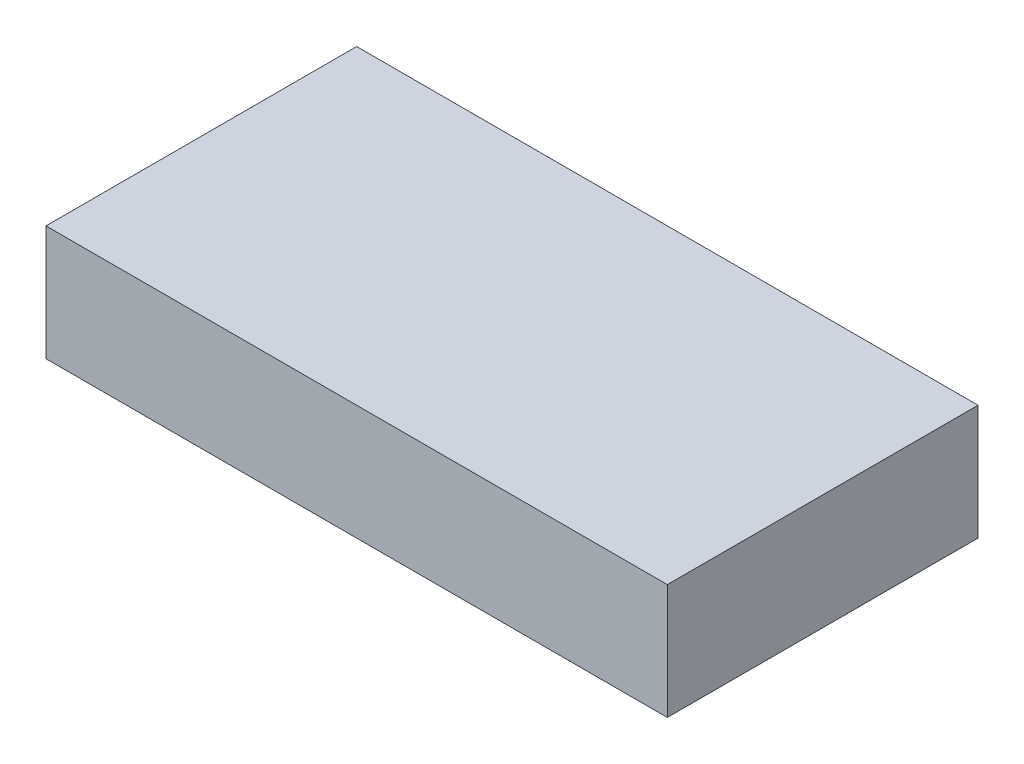
ISO-10303-21;
HEADER;
FILE_DESCRIPTION(('STEP AP214'),'2;1');
FILE_NAME('part.step','',(''),(''),'','','');
FILE_SCHEMA(('AUTOMOTIVE_DESIGN { 1 0 10303 214 1 1 1 1 }'));
ENDSEC;
DATA;
#1=APPLICATION_CONTEXT('core data for automotive mechanical design processes');
#2=APPLICATION_PROTOCOL_DEFINITION('international standard','automotive_design',2000,#1);
#3=PRODUCT_CONTEXT('',#1,'mechanical');
#4=PRODUCT('Part','Part','',(#3));
#5=PRODUCT_RELATED_PRODUCT_CATEGORY('part','',(#4));
#6=PRODUCT_DEFINITION_FORMATION('','',#4);
#7=PRODUCT_DEFINITION_CONTEXT('part definition',#1,'design');
#8=PRODUCT_DEFINITION('design','',#6,#7);
#9=PRODUCT_DEFINITION_SHAPE('','',#8);
#10=(LENGTH_UNIT() NAMED_UNIT(*) SI_UNIT(.MILLI.,.METRE.));
#11=(NAMED_UNIT(*) PLANE_ANGLE_UNIT() SI_UNIT($,.RADIAN.));
#12=(NAMED_UNIT(*) SI_UNIT($,.STERADIAN.) SOLID_ANGLE_UNIT());
#13=UNCERTAINTY_MEASURE_WITH_UNIT(LENGTH_MEASURE(1.E-05),#10,'distance_accuracy_value','');
#14=(GEOMETRIC_REPRESENTATION_CONTEXT(3) GLOBAL_UNCERTAINTY_ASSIGNED_CONTEXT((#13)) GLOBAL_UNIT_ASSIGNED_CONTEXT((#10,
#11,#12)) REPRESENTATION_CONTEXT('',''));
#15=CARTESIAN_POINT('',(0.,0.,0.));
#16=DIRECTION('',(0.,0.,1.));
#17=DIRECTION('',(1.,0.,0.));
#18=AXIS2_PLACEMENT_3D('',#15,#16,#17);
#19=CARTESIAN_POINT('',(0.,8.89,0.));
#20=DIRECTION('',(1.,0.,0.));
#21=DIRECTION('',(0.,0.,-1.));
#22=AXIS2_PLACEMENT_3D('',#19,#20,#21);
#23=PLANE('',#22);
#24=DIRECTION('',(0.,0.,1.));
#25=VECTOR('',#24,1.);
#26=CARTESIAN_POINT('',(0.,0.,0.));
#27=LINE('',#26,#25);
#28=CARTESIAN_POINT('',(0.,0.,-24.));
#29=VERTEX_POINT('',#28);
#30=CARTESIAN_POINT('',(0.,0.,0.));
#31=VERTEX_POINT('',#30);
#32=EDGE_CURVE('E95',#29,#31,#27,.T.);
#33=ORIENTED_EDGE('',*,*,#32,.T.);
#34=DIRECTION('',(0.,-1.,0.));
#35=VECTOR('',#34,1.);
#36=CARTESIAN_POINT('',(0.,8.89,0.));
#37=LINE('',#36,#35);
#38=CARTESIAN_POINT('',(0.,8.89,0.));
#39=VERTEX_POINT('',#38);
#40=EDGE_CURVE('E11',#39,#31,#37,.T.);
#41=ORIENTED_EDGE('',*,*,#40,.F.);
#42=DIRECTION('',(0.,0.,1.));
#43=VECTOR('',#42,1.);
#44=CARTESIAN_POINT('',(0.,8.89,0.));
#45=LINE('',#44,#43);
#46=CARTESIAN_POINT('',(0.,8.89,-24.));
#47=VERTEX_POINT('',#46);
#48=EDGE_CURVE('E83',#47,#39,#45,.T.);
#49=ORIENTED_EDGE('',*,*,#48,.F.);
#50=DIRECTION('',(0.,-1.,0.));
#51=VECTOR('',#50,1.);
#52=CARTESIAN_POINT('',(0.,8.89,-24.));
#53=LINE('',#52,#51);
#54=EDGE_CURVE('E91',#47,#29,#53,.T.);
#55=ORIENTED_EDGE('',*,*,#54,.T.);
#56=EDGE_LOOP('',(#33,#41,#49,#55));
#57=FACE_BOUND('',#56,.T.);
#58=ADVANCED_FACE('F32',(#57),#23,.F.);
#59=CARTESIAN_POINT('',(0.,8.89,0.));
#60=DIRECTION('',(0.,0.,-1.));
#61=DIRECTION('',(-1.,0.,0.));
#62=AXIS2_PLACEMENT_3D('',#59,#60,#61);
#63=PLANE('',#62);
#64=DIRECTION('',(1.,0.,0.));
#65=VECTOR('',#64,1.);
#66=CARTESIAN_POINT('',(0.,0.,0.));
#67=LINE('',#66,#65);
#68=CARTESIAN_POINT('',(48.,0.,0.));
#69=VERTEX_POINT('',#68);
#70=EDGE_CURVE('E87',#31,#69,#67,.T.);
#71=ORIENTED_EDGE('',*,*,#70,.T.);
#72=DIRECTION('',(0.,-1.,0.));
#73=VECTOR('',#72,1.);
#74=CARTESIAN_POINT('',(48.,8.89,0.));
#75=LINE('',#74,#73);
#76=CARTESIAN_POINT('',(48.,8.89,0.));
#77=VERTEX_POINT('',#76);
#78=EDGE_CURVE('E40',#77,#69,#75,.T.);
#79=ORIENTED_EDGE('',*,*,#78,.F.);
#80=DIRECTION('',(1.,0.,0.));
#81=VECTOR('',#80,1.);
#82=CARTESIAN_POINT('',(0.,8.89,0.));
#83=LINE('',#82,#81);
#84=EDGE_CURVE('E78',#39,#77,#83,.T.);
#85=ORIENTED_EDGE('',*,*,#84,.F.);
#86=ORIENTED_EDGE('',*,*,#40,.T.);
#87=EDGE_LOOP('',(#71,#79,#85,#86));
#88=FACE_BOUND('',#87,.T.);
#89=ADVANCED_FACE('F86',(#88),#63,.F.);
#90=CARTESIAN_POINT('',(48.,8.89,0.));
#91=DIRECTION('',(-1.,0.,0.));
#92=DIRECTION('',(0.,0.,1.));
#93=AXIS2_PLACEMENT_3D('',#90,#91,#92);
#94=PLANE('',#93);
#95=DIRECTION('',(0.,0.,-1.));
#96=VECTOR('',#95,1.);
#97=CARTESIAN_POINT('',(48.,0.,0.));
#98=LINE('',#97,#96);
#99=CARTESIAN_POINT('',(48.,0.,-24.));
#100=VERTEX_POINT('',#99);
#101=EDGE_CURVE('E65',#69,#100,#98,.T.);
#102=ORIENTED_EDGE('',*,*,#101,.T.);
#103=DIRECTION('',(0.,-1.,0.));
#104=VECTOR('',#103,1.);
#105=CARTESIAN_POINT('',(48.,8.89,-24.));
#106=LINE('',#105,#104);
#107=CARTESIAN_POINT('',(48.,8.89,-24.));
#108=VERTEX_POINT('',#107);
#109=EDGE_CURVE('E88',#108,#100,#106,.T.);
#110=ORIENTED_EDGE('',*,*,#109,.F.);
#111=DIRECTION('',(0.,0.,-1.));
#112=VECTOR('',#111,1.);
#113=CARTESIAN_POINT('',(48.,8.89,0.));
#114=LINE('',#113,#112);
#115=EDGE_CURVE('E81',#77,#108,#114,.T.);
#116=ORIENTED_EDGE('',*,*,#115,.F.);
#117=ORIENTED_EDGE('',*,*,#78,.T.);
#118=EDGE_LOOP('',(#102,#110,#116,#117));
#119=FACE_BOUND('',#118,.T.);
#120=ADVANCED_FACE('F89',(#119),#94,.F.);
#121=CARTESIAN_POINT('',(0.,8.89,-24.));
#122=DIRECTION('',(0.,0.,1.));
#123=DIRECTION('',(1.,0.,0.));
#124=AXIS2_PLACEMENT_3D('',#121,#122,#123);
#125=PLANE('',#124);
#126=DIRECTION('',(-1.,0.,0.));
#127=VECTOR('',#126,1.);
#128=CARTESIAN_POINT('',(0.,0.,-24.));
#129=LINE('',#128,#127);
#130=EDGE_CURVE('E71',#100,#29,#129,.T.);
#131=ORIENTED_EDGE('',*,*,#130,.T.);
#132=ORIENTED_EDGE('',*,*,#54,.F.);
#133=DIRECTION('',(-1.,0.,0.));
#134=VECTOR('',#133,1.);
#135=CARTESIAN_POINT('',(0.,8.89,-24.));
#136=LINE('',#135,#134);
#137=EDGE_CURVE('E48',#108,#47,#136,.T.);
#138=ORIENTED_EDGE('',*,*,#137,.F.);
#139=ORIENTED_EDGE('',*,*,#109,.T.);
#140=EDGE_LOOP('',(#131,#132,#138,#139));
#141=FACE_BOUND('',#140,.T.);
#142=ADVANCED_FACE('F102',(#141),#125,.F.);
#143=CARTESIAN_POINT('',(0.,8.89,0.));
#144=DIRECTION('',(0.,-1.,0.));
#145=DIRECTION('',(0.,0.,-1.));
#146=AXIS2_PLACEMENT_3D('',#143,#144,#145);
#147=PLANE('',#146);
#148=ORIENTED_EDGE('',*,*,#48,.T.);
#149=ORIENTED_EDGE('',*,*,#84,.T.);
#150=ORIENTED_EDGE('',*,*,#115,.T.);
#151=ORIENTED_EDGE('',*,*,#137,.T.);
#152=EDGE_LOOP('',(#148,#149,#150,#151));
#153=FACE_BOUND('',#152,.T.);
#154=ADVANCED_FACE('F79',(#153),#147,.F.);
#155=CARTESIAN_POINT('',(0.,0.,0.));
#156=DIRECTION('',(0.,-1.,0.));
#157=DIRECTION('',(0.,0.,-1.));
#158=AXIS2_PLACEMENT_3D('',#155,#156,#157);
#159=PLANE('',#158);
#160=ORIENTED_EDGE('',*,*,#32,.F.);
#161=ORIENTED_EDGE('',*,*,#130,.F.);
#162=ORIENTED_EDGE('',*,*,#101,.F.);
#163=ORIENTED_EDGE('',*,*,#70,.F.);
#164=EDGE_LOOP('',(#160,#161,#162,#163));
#165=FACE_BOUND('',#164,.T.);
#166=ADVANCED_FACE('F105',(#165),#159,.T.);
#167=CLOSED_SHELL('',(#58,#89,#120,#142,#154,#166));
#168=MANIFOLD_SOLID_BREP('B2',#167);
#169=ADVANCED_BREP_SHAPE_REPRESENTATION('',(#18,#168),#14);
#170=SHAPE_DEFINITION_REPRESENTATION(#9,#169);
ENDSEC;
END-ISO-10303-21;
